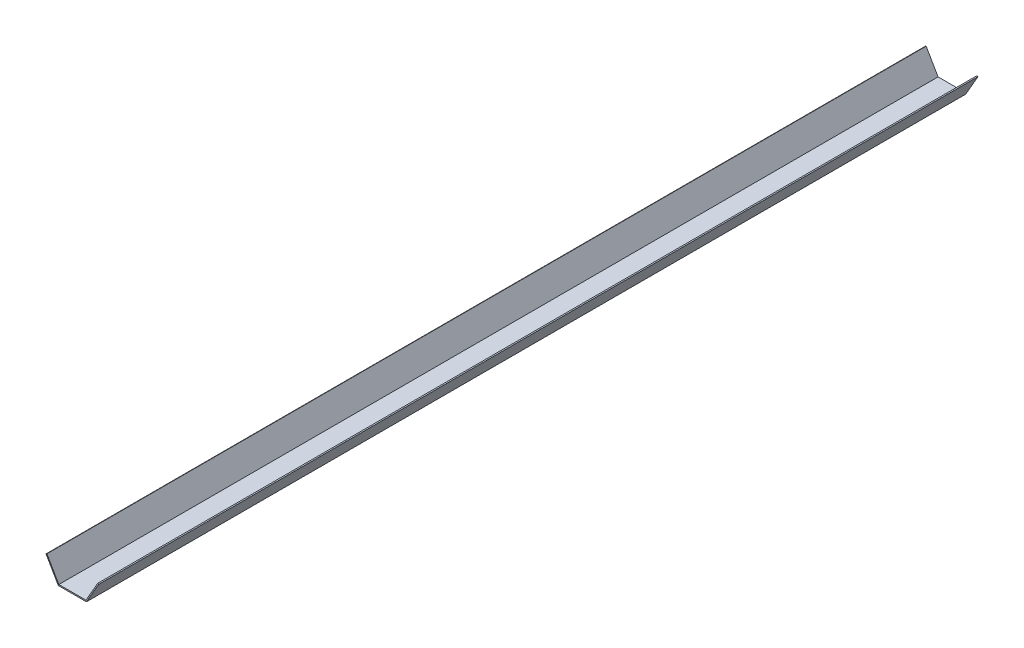
ISO-10303-21;
HEADER;
FILE_DESCRIPTION(('STEP AP214'),'2;1');
FILE_NAME('part.step','',(''),(''),'','','');
FILE_SCHEMA(('AUTOMOTIVE_DESIGN { 1 0 10303 214 1 1 1 1 }'));
ENDSEC;
DATA;
#1=APPLICATION_CONTEXT('core data for automotive mechanical design processes');
#2=APPLICATION_PROTOCOL_DEFINITION('international standard','automotive_design',2000,#1);
#3=PRODUCT_CONTEXT('',#1,'mechanical');
#4=PRODUCT('Part','Part','',(#3));
#5=PRODUCT_RELATED_PRODUCT_CATEGORY('part','',(#4));
#6=PRODUCT_DEFINITION_FORMATION('','',#4);
#7=PRODUCT_DEFINITION_CONTEXT('part definition',#1,'design');
#8=PRODUCT_DEFINITION('design','',#6,#7);
#9=PRODUCT_DEFINITION_SHAPE('','',#8);
#10=(LENGTH_UNIT() NAMED_UNIT(*) SI_UNIT(.MILLI.,.METRE.));
#11=(NAMED_UNIT(*) PLANE_ANGLE_UNIT() SI_UNIT($,.RADIAN.));
#12=(NAMED_UNIT(*) SI_UNIT($,.STERADIAN.) SOLID_ANGLE_UNIT());
#13=UNCERTAINTY_MEASURE_WITH_UNIT(LENGTH_MEASURE(1.E-05),#10,'distance_accuracy_value','');
#14=(GEOMETRIC_REPRESENTATION_CONTEXT(3) GLOBAL_UNCERTAINTY_ASSIGNED_CONTEXT((#13)) GLOBAL_UNIT_ASSIGNED_CONTEXT((#10,
#11,#12)) REPRESENTATION_CONTEXT('',''));
#15=CARTESIAN_POINT('',(0.,0.,0.));
#16=DIRECTION('',(0.,0.,1.));
#17=DIRECTION('',(1.,0.,0.));
#18=AXIS2_PLACEMENT_3D('',#15,#16,#17);
#19=CARTESIAN_POINT('',(-37.4999999999999,28.6099272381321,1250.));
#20=DIRECTION('',(0.86602540378444,0.499999999999998,0.));
#21=DIRECTION('',(-0.499999999999998,0.86602540378444,0.));
#22=AXIS2_PLACEMENT_3D('',#19,#20,#21);
#23=PLANE('',#22);
#24=DIRECTION('',(0.499999999999998,-0.86602540378444,0.));
#25=VECTOR('',#24,1.);
#26=CARTESIAN_POINT('',(-37.4999999999999,28.6099272381321,0.));
#27=LINE('',#26,#25);
#28=CARTESIAN_POINT('',(-37.4999999999999,28.6099272381321,0.));
#29=VERTEX_POINT('',#28);
#30=CARTESIAN_POINT('',(-20.,-1.70096189432334,0.));
#31=VERTEX_POINT('',#30);
#32=EDGE_CURVE('E131',#29,#31,#27,.T.);
#33=ORIENTED_EDGE('',*,*,#32,.T.);
#34=DIRECTION('',(0.,0.,-1.));
#35=VECTOR('',#34,1.);
#36=CARTESIAN_POINT('',(-20.,-1.70096189432334,1250.));
#37=LINE('',#36,#35);
#38=CARTESIAN_POINT('',(-20.,-1.70096189432334,1250.));
#39=VERTEX_POINT('',#38);
#40=EDGE_CURVE('E11',#39,#31,#37,.T.);
#41=ORIENTED_EDGE('',*,*,#40,.F.);
#42=DIRECTION('',(0.499999999999998,-0.86602540378444,0.));
#43=VECTOR('',#42,1.);
#44=CARTESIAN_POINT('',(-37.4999999999999,28.6099272381321,1250.));
#45=LINE('',#44,#43);
#46=CARTESIAN_POINT('',(-37.4999999999999,28.6099272381321,1250.));
#47=VERTEX_POINT('',#46);
#48=EDGE_CURVE('E145',#47,#39,#45,.T.);
#49=ORIENTED_EDGE('',*,*,#48,.F.);
#50=DIRECTION('',(0.,0.,-1.));
#51=VECTOR('',#50,1.);
#52=CARTESIAN_POINT('',(-37.4999999999999,28.6099272381321,1250.));
#53=LINE('',#52,#51);
#54=EDGE_CURVE('E127',#47,#29,#53,.T.);
#55=ORIENTED_EDGE('',*,*,#54,.T.);
#56=EDGE_LOOP('',(#33,#41,#49,#55));
#57=FACE_BOUND('',#56,.T.);
#58=ADVANCED_FACE('F35',(#57),#23,.F.);
#59=CARTESIAN_POINT('',(-20.,-1.70096189432334,1250.));
#60=DIRECTION('',(0.,1.,0.));
#61=DIRECTION('',(0.,0.,1.));
#62=AXIS2_PLACEMENT_3D('',#59,#60,#61);
#63=PLANE('',#62);
#64=DIRECTION('',(1.,0.,0.));
#65=VECTOR('',#64,1.);
#66=CARTESIAN_POINT('',(-20.,-1.70096189432334,0.));
#67=LINE('',#66,#65);
#68=CARTESIAN_POINT('',(20.,-1.70096189432334,0.));
#69=VERTEX_POINT('',#68);
#70=EDGE_CURVE('E134',#31,#69,#67,.T.);
#71=ORIENTED_EDGE('',*,*,#70,.T.);
#72=DIRECTION('',(0.,0.,-1.));
#73=VECTOR('',#72,1.);
#74=CARTESIAN_POINT('',(20.,-1.70096189432334,1250.));
#75=LINE('',#74,#73);
#76=CARTESIAN_POINT('',(20.,-1.70096189432334,1250.));
#77=VERTEX_POINT('',#76);
#78=EDGE_CURVE('E43',#77,#69,#75,.T.);
#79=ORIENTED_EDGE('',*,*,#78,.F.);
#80=DIRECTION('',(1.,0.,0.));
#81=VECTOR('',#80,1.);
#82=CARTESIAN_POINT('',(-20.,-1.70096189432334,1250.));
#83=LINE('',#82,#81);
#84=EDGE_CURVE('E94',#39,#77,#83,.T.);
#85=ORIENTED_EDGE('',*,*,#84,.F.);
#86=ORIENTED_EDGE('',*,*,#40,.T.);
#87=EDGE_LOOP('',(#71,#79,#85,#86));
#88=FACE_BOUND('',#87,.T.);
#89=ADVANCED_FACE('F180',(#88),#63,.F.);
#90=CARTESIAN_POINT('',(20.,-1.70096189432334,1250.));
#91=DIRECTION('',(-0.86602540378444,0.499999999999998,0.));
#92=DIRECTION('',(-0.499999999999998,-0.86602540378444,0.));
#93=AXIS2_PLACEMENT_3D('',#90,#91,#92);
#94=PLANE('',#93);
#95=DIRECTION('',(0.499999999999998,0.86602540378444,0.));
#96=VECTOR('',#95,1.);
#97=CARTESIAN_POINT('',(20.,-1.70096189432334,0.));
#98=LINE('',#97,#96);
#99=CARTESIAN_POINT('',(37.4999999999999,28.6099272381321,0.));
#100=VERTEX_POINT('',#99);
#101=EDGE_CURVE('E136',#69,#100,#98,.T.);
#102=ORIENTED_EDGE('',*,*,#101,.T.);
#103=DIRECTION('',(0.,0.,-1.));
#104=VECTOR('',#103,1.);
#105=CARTESIAN_POINT('',(37.4999999999999,28.6099272381321,1250.));
#106=LINE('',#105,#104);
#107=CARTESIAN_POINT('',(37.4999999999999,28.6099272381321,1250.));
#108=VERTEX_POINT('',#107);
#109=EDGE_CURVE('E152',#108,#100,#106,.T.);
#110=ORIENTED_EDGE('',*,*,#109,.F.);
#111=DIRECTION('',(0.499999999999998,0.86602540378444,0.));
#112=VECTOR('',#111,1.);
#113=CARTESIAN_POINT('',(20.,-1.70096189432334,1250.));
#114=LINE('',#113,#112);
#115=EDGE_CURVE('E160',#77,#108,#114,.T.);
#116=ORIENTED_EDGE('',*,*,#115,.F.);
#117=ORIENTED_EDGE('',*,*,#78,.T.);
#118=EDGE_LOOP('',(#102,#110,#116,#117));
#119=FACE_BOUND('',#118,.T.);
#120=ADVANCED_FACE('F158',(#119),#94,.F.);
#121=CARTESIAN_POINT('',(37.4999999999999,28.6099272381321,1250.));
#122=DIRECTION('',(-0.499999999999997,-0.86602540378444,0.));
#123=DIRECTION('',(0.866025403784441,-0.499999999999997,0.));
#124=AXIS2_PLACEMENT_3D('',#121,#122,#123);
#125=PLANE('',#124);
#126=DIRECTION('',(-0.866025403784441,0.499999999999997,0.));
#127=VECTOR('',#126,1.);
#128=CARTESIAN_POINT('',(37.4999999999999,28.6099272381321,0.));
#129=LINE('',#128,#127);
#130=CARTESIAN_POINT('',(36.2009618943233,29.3599272381321,0.));
#131=VERTEX_POINT('',#130);
#132=EDGE_CURVE('E138',#100,#131,#129,.T.);
#133=ORIENTED_EDGE('',*,*,#132,.T.);
#134=DIRECTION('',(0.,0.,-1.));
#135=VECTOR('',#134,1.);
#136=CARTESIAN_POINT('',(36.2009618943233,29.3599272381321,1250.));
#137=LINE('',#136,#135);
#138=CARTESIAN_POINT('',(36.2009618943233,29.3599272381321,1250.));
#139=VERTEX_POINT('',#138);
#140=EDGE_CURVE('E149',#139,#131,#137,.T.);
#141=ORIENTED_EDGE('',*,*,#140,.F.);
#142=DIRECTION('',(-0.866025403784441,0.499999999999997,0.));
#143=VECTOR('',#142,1.);
#144=CARTESIAN_POINT('',(37.4999999999999,28.6099272381321,1250.));
#145=LINE('',#144,#143);
#146=EDGE_CURVE('E172',#108,#139,#145,.T.);
#147=ORIENTED_EDGE('',*,*,#146,.F.);
#148=ORIENTED_EDGE('',*,*,#109,.T.);
#149=EDGE_LOOP('',(#133,#141,#147,#148));
#150=FACE_BOUND('',#149,.T.);
#151=ADVANCED_FACE('F168',(#150),#125,.F.);
#152=CARTESIAN_POINT('',(36.2009618943233,29.3599272381321,1250.));
#153=DIRECTION('',(0.86602540378444,-0.499999999999998,0.));
#154=DIRECTION('',(0.499999999999998,0.86602540378444,0.));
#155=AXIS2_PLACEMENT_3D('',#152,#153,#154);
#156=PLANE('',#155);
#157=DIRECTION('',(-0.499999999999998,-0.86602540378444,0.));
#158=VECTOR('',#157,1.);
#159=CARTESIAN_POINT('',(36.2009618943233,29.3599272381321,0.));
#160=LINE('',#159,#158);
#161=CARTESIAN_POINT('',(19.25,0.,0.));
#162=VERTEX_POINT('',#161);
#163=EDGE_CURVE('E140',#131,#162,#160,.T.);
#164=ORIENTED_EDGE('',*,*,#163,.T.);
#165=DIRECTION('',(0.,0.,-1.));
#166=VECTOR('',#165,1.);
#167=CARTESIAN_POINT('',(19.25,0.,1250.));
#168=LINE('',#167,#166);
#169=CARTESIAN_POINT('',(19.25,0.,1250.));
#170=VERTEX_POINT('',#169);
#171=EDGE_CURVE('E122',#170,#162,#168,.T.);
#172=ORIENTED_EDGE('',*,*,#171,.F.);
#173=DIRECTION('',(-0.499999999999998,-0.86602540378444,0.));
#174=VECTOR('',#173,1.);
#175=CARTESIAN_POINT('',(36.2009618943233,29.3599272381321,1250.));
#176=LINE('',#175,#174);
#177=EDGE_CURVE('E113',#139,#170,#176,.T.);
#178=ORIENTED_EDGE('',*,*,#177,.F.);
#179=ORIENTED_EDGE('',*,*,#140,.T.);
#180=EDGE_LOOP('',(#164,#172,#178,#179));
#181=FACE_BOUND('',#180,.T.);
#182=ADVANCED_FACE('F171',(#181),#156,.F.);
#183=CARTESIAN_POINT('',(19.25,0.,1250.));
#184=DIRECTION('',(0.,-1.,0.));
#185=DIRECTION('',(1.,0.,0.));
#186=AXIS2_PLACEMENT_3D('',#183,#184,#185);
#187=PLANE('',#186);
#188=DIRECTION('',(-1.,0.,0.));
#189=VECTOR('',#188,1.);
#190=CARTESIAN_POINT('',(19.25,0.,0.));
#191=LINE('',#190,#189);
#192=CARTESIAN_POINT('',(-19.25,0.,0.));
#193=VERTEX_POINT('',#192);
#194=EDGE_CURVE('E121',#162,#193,#191,.T.);
#195=ORIENTED_EDGE('',*,*,#194,.T.);
#196=DIRECTION('',(0.,0.,-1.));
#197=VECTOR('',#196,1.);
#198=CARTESIAN_POINT('',(-19.25,0.,1250.));
#199=LINE('',#198,#197);
#200=CARTESIAN_POINT('',(-19.25,0.,1250.));
#201=VERTEX_POINT('',#200);
#202=EDGE_CURVE('E118',#201,#193,#199,.T.);
#203=ORIENTED_EDGE('',*,*,#202,.F.);
#204=DIRECTION('',(-1.,0.,0.));
#205=VECTOR('',#204,1.);
#206=CARTESIAN_POINT('',(19.25,0.,1250.));
#207=LINE('',#206,#205);
#208=EDGE_CURVE('E107',#170,#201,#207,.T.);
#209=ORIENTED_EDGE('',*,*,#208,.F.);
#210=ORIENTED_EDGE('',*,*,#171,.T.);
#211=EDGE_LOOP('',(#195,#203,#209,#210));
#212=FACE_BOUND('',#211,.T.);
#213=ADVANCED_FACE('F119',(#212),#187,.F.);
#214=CARTESIAN_POINT('',(-19.25,0.,1250.));
#215=DIRECTION('',(-0.86602540378444,-0.499999999999998,0.));
#216=DIRECTION('',(0.499999999999998,-0.86602540378444,0.));
#217=AXIS2_PLACEMENT_3D('',#214,#215,#216);
#218=PLANE('',#217);
#219=DIRECTION('',(-0.499999999999998,0.86602540378444,0.));
#220=VECTOR('',#219,1.);
#221=CARTESIAN_POINT('',(-19.25,0.,0.));
#222=LINE('',#221,#220);
#223=CARTESIAN_POINT('',(-36.2009618943233,29.359927238132,0.));
#224=VERTEX_POINT('',#223);
#225=EDGE_CURVE('E80',#193,#224,#222,.T.);
#226=ORIENTED_EDGE('',*,*,#225,.T.);
#227=DIRECTION('',(0.,0.,-1.));
#228=VECTOR('',#227,1.);
#229=CARTESIAN_POINT('',(-36.2009618943233,29.359927238132,1250.));
#230=LINE('',#229,#228);
#231=CARTESIAN_POINT('',(-36.2009618943233,29.359927238132,1250.));
#232=VERTEX_POINT('',#231);
#233=EDGE_CURVE('E123',#232,#224,#230,.T.);
#234=ORIENTED_EDGE('',*,*,#233,.F.);
#235=DIRECTION('',(-0.499999999999998,0.86602540378444,0.));
#236=VECTOR('',#235,1.);
#237=CARTESIAN_POINT('',(-19.25,0.,1250.));
#238=LINE('',#237,#236);
#239=EDGE_CURVE('E111',#201,#232,#238,.T.);
#240=ORIENTED_EDGE('',*,*,#239,.F.);
#241=ORIENTED_EDGE('',*,*,#202,.T.);
#242=EDGE_LOOP('',(#226,#234,#240,#241));
#243=FACE_BOUND('',#242,.T.);
#244=ADVANCED_FACE('F125',(#243),#218,.F.);
#245=CARTESIAN_POINT('',(-37.4999999999999,28.6099272381321,1250.));
#246=DIRECTION('',(0.499999999999997,-0.86602540378444,0.));
#247=DIRECTION('',(0.866025403784441,0.499999999999997,0.));
#248=AXIS2_PLACEMENT_3D('',#245,#246,#247);
#249=PLANE('',#248);
#250=DIRECTION('',(-0.866025403784441,-0.499999999999997,0.));
#251=VECTOR('',#250,1.);
#252=CARTESIAN_POINT('',(-37.4999999999999,28.6099272381321,0.));
#253=LINE('',#252,#251);
#254=EDGE_CURVE('E86',#224,#29,#253,.T.);
#255=ORIENTED_EDGE('',*,*,#254,.T.);
#256=ORIENTED_EDGE('',*,*,#54,.F.);
#257=DIRECTION('',(-0.866025403784441,-0.499999999999997,0.));
#258=VECTOR('',#257,1.);
#259=CARTESIAN_POINT('',(-37.4999999999999,28.6099272381321,1250.));
#260=LINE('',#259,#258);
#261=EDGE_CURVE('E51',#232,#47,#260,.T.);
#262=ORIENTED_EDGE('',*,*,#261,.F.);
#263=ORIENTED_EDGE('',*,*,#233,.T.);
#264=EDGE_LOOP('',(#255,#256,#262,#263));
#265=FACE_BOUND('',#264,.T.);
#266=ADVANCED_FACE('F196',(#265),#249,.F.);
#267=CARTESIAN_POINT('',(0.,0.,1250.));
#268=DIRECTION('',(0.,0.,1.));
#269=DIRECTION('',(1.,0.,0.));
#270=AXIS2_PLACEMENT_3D('',#267,#268,#269);
#271=PLANE('',#270);
#272=ORIENTED_EDGE('',*,*,#48,.T.);
#273=ORIENTED_EDGE('',*,*,#84,.T.);
#274=ORIENTED_EDGE('',*,*,#115,.T.);
#275=ORIENTED_EDGE('',*,*,#146,.T.);
#276=ORIENTED_EDGE('',*,*,#177,.T.);
#277=ORIENTED_EDGE('',*,*,#208,.T.);
#278=ORIENTED_EDGE('',*,*,#239,.T.);
#279=ORIENTED_EDGE('',*,*,#261,.T.);
#280=EDGE_LOOP('',(#272,#273,#274,#275,#276,#277,#278,#279));
#281=FACE_BOUND('',#280,.T.);
#282=ADVANCED_FACE('F109',(#281),#271,.T.);
#283=CARTESIAN_POINT('',(0.,0.,0.));
#284=DIRECTION('',(0.,0.,1.));
#285=DIRECTION('',(1.,0.,0.));
#286=AXIS2_PLACEMENT_3D('',#283,#284,#285);
#287=PLANE('',#286);
#288=ORIENTED_EDGE('',*,*,#32,.F.);
#289=ORIENTED_EDGE('',*,*,#254,.F.);
#290=ORIENTED_EDGE('',*,*,#225,.F.);
#291=ORIENTED_EDGE('',*,*,#194,.F.);
#292=ORIENTED_EDGE('',*,*,#163,.F.);
#293=ORIENTED_EDGE('',*,*,#132,.F.);
#294=ORIENTED_EDGE('',*,*,#101,.F.);
#295=ORIENTED_EDGE('',*,*,#70,.F.);
#296=EDGE_LOOP('',(#288,#289,#290,#291,#292,#293,#294,#295));
#297=FACE_BOUND('',#296,.T.);
#298=ADVANCED_FACE('F164',(#297),#287,.F.);
#299=CLOSED_SHELL('',(#58,#89,#120,#151,#182,#213,#244,#266,#282,#298));
#300=MANIFOLD_SOLID_BREP('B2',#299);
#301=ADVANCED_BREP_SHAPE_REPRESENTATION('',(#18,#300),#14);
#302=SHAPE_DEFINITION_REPRESENTATION(#9,#301);
ENDSEC;
END-ISO-10303-21;
